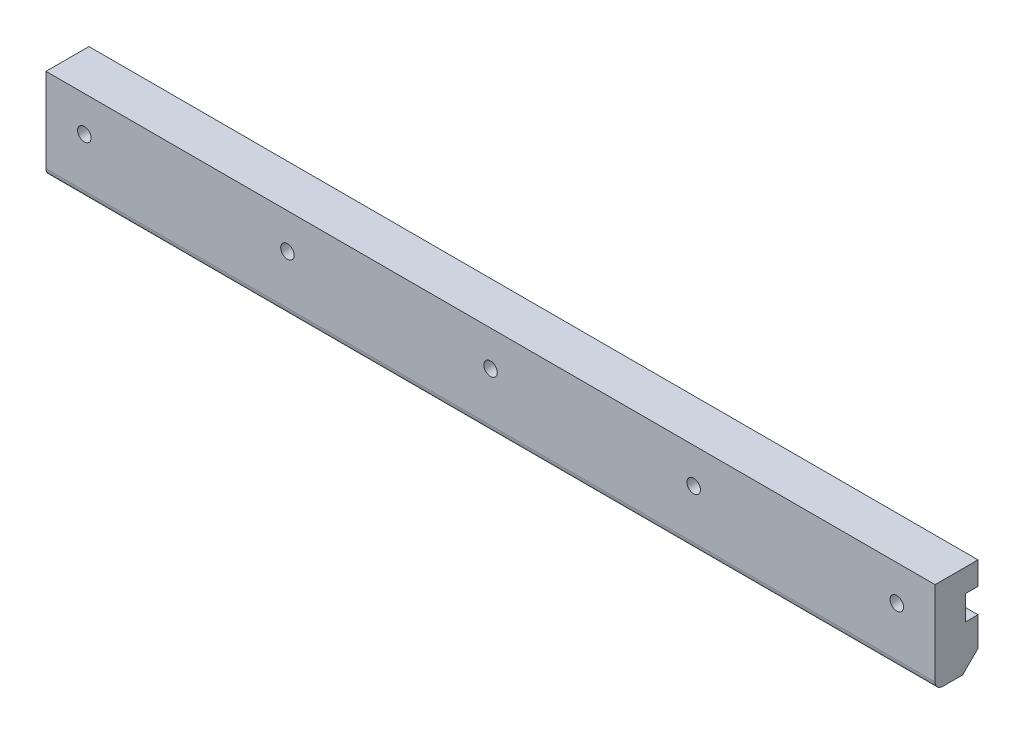
ISO-10303-21;
HEADER;
FILE_DESCRIPTION(('STEP AP214'),'2;1');
FILE_NAME('part.step','',(''),(''),'','','');
FILE_SCHEMA(('AUTOMOTIVE_DESIGN { 1 0 10303 214 1 1 1 1 }'));
ENDSEC;
DATA;
#1=APPLICATION_CONTEXT('core data for automotive mechanical design processes');
#2=APPLICATION_PROTOCOL_DEFINITION('international standard','automotive_design',2000,#1);
#3=PRODUCT_CONTEXT('',#1,'mechanical');
#4=PRODUCT('Part','Part','',(#3));
#5=PRODUCT_RELATED_PRODUCT_CATEGORY('part','',(#4));
#6=PRODUCT_DEFINITION_FORMATION('','',#4);
#7=PRODUCT_DEFINITION_CONTEXT('part definition',#1,'design');
#8=PRODUCT_DEFINITION('design','',#6,#7);
#9=PRODUCT_DEFINITION_SHAPE('','',#8);
#10=(LENGTH_UNIT() NAMED_UNIT(*) SI_UNIT(.MILLI.,.METRE.));
#11=(NAMED_UNIT(*) PLANE_ANGLE_UNIT() SI_UNIT($,.RADIAN.));
#12=(NAMED_UNIT(*) SI_UNIT($,.STERADIAN.) SOLID_ANGLE_UNIT());
#13=UNCERTAINTY_MEASURE_WITH_UNIT(LENGTH_MEASURE(1.E-05),#10,'distance_accuracy_value','');
#14=(GEOMETRIC_REPRESENTATION_CONTEXT(3) GLOBAL_UNCERTAINTY_ASSIGNED_CONTEXT((#13)) GLOBAL_UNIT_ASSIGNED_CONTEXT((#10,
#11,#12)) REPRESENTATION_CONTEXT('',''));
#15=CARTESIAN_POINT('',(0.,0.,0.));
#16=DIRECTION('',(0.,0.,1.));
#17=DIRECTION('',(1.,0.,0.));
#18=AXIS2_PLACEMENT_3D('',#15,#16,#17);
#19=CARTESIAN_POINT('',(580.,0.,-20.));
#20=DIRECTION('',(0.,0.,1.));
#21=DIRECTION('',(0.,-1.,0.));
#22=AXIS2_PLACEMENT_3D('',#19,#20,#21);
#23=PLANE('',#22);
#24=CARTESIAN_POINT('',(555.,37.,-20.));
#25=DIRECTION('',(0.,0.,-1.));
#26=DIRECTION('',(0.,1.,0.));
#27=AXIS2_PLACEMENT_3D('',#24,#25,#26);
#28=CIRCLE('',#27,4.39999999999996);
#29=CARTESIAN_POINT('',(555.,41.3999999999999,-20.));
#30=VERTEX_POINT('',#29);
#31=EDGE_CURVE('E172',#30,#30,#28,.T.);
#32=ORIENTED_EDGE('',*,*,#31,.F.);
#33=EDGE_LOOP('',(#32));
#34=FACE_BOUND('',#33,.T.);
#35=CARTESIAN_POINT('',(422.5,37.,-20.));
#36=DIRECTION('',(0.,0.,-1.));
#37=DIRECTION('',(0.,1.,0.));
#38=AXIS2_PLACEMENT_3D('',#35,#36,#37);
#39=CIRCLE('',#38,4.40000000000001);
#40=CARTESIAN_POINT('',(422.5,41.4,-20.));
#41=VERTEX_POINT('',#40);
#42=EDGE_CURVE('E168',#41,#41,#39,.T.);
#43=ORIENTED_EDGE('',*,*,#42,.F.);
#44=EDGE_LOOP('',(#43));
#45=FACE_BOUND('',#44,.T.);
#46=CARTESIAN_POINT('',(290.,37.,-20.));
#47=DIRECTION('',(0.,0.,-1.));
#48=DIRECTION('',(0.,1.,0.));
#49=AXIS2_PLACEMENT_3D('',#46,#47,#48);
#50=CIRCLE('',#49,4.40000000000001);
#51=CARTESIAN_POINT('',(290.,41.4,-20.));
#52=VERTEX_POINT('',#51);
#53=EDGE_CURVE('E164',#52,#52,#50,.T.);
#54=ORIENTED_EDGE('',*,*,#53,.F.);
#55=EDGE_LOOP('',(#54));
#56=FACE_BOUND('',#55,.T.);
#57=CARTESIAN_POINT('',(24.9999999999999,37.,-20.));
#58=DIRECTION('',(0.,0.,-1.));
#59=DIRECTION('',(0.,1.,0.));
#60=AXIS2_PLACEMENT_3D('',#57,#58,#59);
#61=CIRCLE('',#60,4.39999999999999);
#62=CARTESIAN_POINT('',(24.9999999999999,41.4,-20.));
#63=VERTEX_POINT('',#62);
#64=EDGE_CURVE('E228',#63,#63,#61,.T.);
#65=ORIENTED_EDGE('',*,*,#64,.F.);
#66=EDGE_LOOP('',(#65));
#67=FACE_BOUND('',#66,.T.);
#68=DIRECTION('',(0.,1.,0.));
#69=VECTOR('',#68,1.);
#70=CARTESIAN_POINT('',(0.,0.,-20.));
#71=LINE('',#70,#69);
#72=CARTESIAN_POINT('',(0.,29.,-20.));
#73=VERTEX_POINT('',#72);
#74=CARTESIAN_POINT('',(0.,45.,-20.));
#75=VERTEX_POINT('',#74);
#76=EDGE_CURVE('E138',#73,#75,#71,.T.);
#77=ORIENTED_EDGE('',*,*,#76,.T.);
#78=DIRECTION('',(-1.,0.,0.));
#79=VECTOR('',#78,1.);
#80=CARTESIAN_POINT('',(580.,45.,-20.));
#81=LINE('',#80,#79);
#82=CARTESIAN_POINT('',(580.,45.,-20.));
#83=VERTEX_POINT('',#82);
#84=EDGE_CURVE('E198',#83,#75,#81,.T.);
#85=ORIENTED_EDGE('',*,*,#84,.F.);
#86=DIRECTION('',(0.,1.,0.));
#87=VECTOR('',#86,1.);
#88=CARTESIAN_POINT('',(580.,0.,-20.));
#89=LINE('',#88,#87);
#90=CARTESIAN_POINT('',(580.,29.,-20.));
#91=VERTEX_POINT('',#90);
#92=EDGE_CURVE('E134',#91,#83,#89,.T.);
#93=ORIENTED_EDGE('',*,*,#92,.F.);
#94=DIRECTION('',(-1.,0.,0.));
#95=VECTOR('',#94,1.);
#96=CARTESIAN_POINT('',(580.,29.,-20.));
#97=LINE('',#96,#95);
#98=EDGE_CURVE('E200',#91,#73,#97,.T.);
#99=ORIENTED_EDGE('',*,*,#98,.T.);
#100=EDGE_LOOP('',(#77,#85,#93,#99));
#101=FACE_BOUND('',#100,.T.);
#102=CARTESIAN_POINT('',(157.5,37.,-20.));
#103=DIRECTION('',(0.,0.,-1.));
#104=DIRECTION('',(0.,1.,0.));
#105=AXIS2_PLACEMENT_3D('',#102,#103,#104);
#106=CIRCLE('',#105,4.39999999999999);
#107=CARTESIAN_POINT('',(157.5,41.4,-20.));
#108=VERTEX_POINT('',#107);
#109=EDGE_CURVE('E163',#108,#108,#106,.T.);
#110=ORIENTED_EDGE('',*,*,#109,.F.);
#111=EDGE_LOOP('',(#110));
#112=FACE_BOUND('',#111,.T.);
#113=ADVANCED_FACE('F41',(#34,#45,#56,#67,#101,#112),#23,.F.);
#114=CARTESIAN_POINT('',(580.,45.,0.));
#115=DIRECTION('',(0.,1.,0.));
#116=DIRECTION('',(0.,0.,1.));
#117=AXIS2_PLACEMENT_3D('',#114,#115,#116);
#118=PLANE('',#117);
#119=DIRECTION('',(0.,0.,-1.));
#120=VECTOR('',#119,1.);
#121=CARTESIAN_POINT('',(0.,45.,0.));
#122=LINE('',#121,#120);
#123=CARTESIAN_POINT('',(0.,45.,-28.));
#124=VERTEX_POINT('',#123);
#125=EDGE_CURVE('E142',#75,#124,#122,.T.);
#126=ORIENTED_EDGE('',*,*,#125,.T.);
#127=DIRECTION('',(-1.,0.,0.));
#128=VECTOR('',#127,1.);
#129=CARTESIAN_POINT('',(580.,45.,-28.));
#130=LINE('',#129,#128);
#131=CARTESIAN_POINT('',(580.,45.,-28.));
#132=VERTEX_POINT('',#131);
#133=EDGE_CURVE('E121',#132,#124,#130,.T.);
#134=ORIENTED_EDGE('',*,*,#133,.F.);
#135=DIRECTION('',(0.,0.,-1.));
#136=VECTOR('',#135,1.);
#137=CARTESIAN_POINT('',(580.,45.,0.));
#138=LINE('',#137,#136);
#139=EDGE_CURVE('E128',#83,#132,#138,.T.);
#140=ORIENTED_EDGE('',*,*,#139,.F.);
#141=ORIENTED_EDGE('',*,*,#84,.T.);
#142=EDGE_LOOP('',(#126,#134,#140,#141));
#143=FACE_BOUND('',#142,.T.);
#144=ADVANCED_FACE('F140',(#143),#118,.F.);
#145=CARTESIAN_POINT('',(580.,0.,-28.));
#146=DIRECTION('',(0.,0.,1.));
#147=DIRECTION('',(1.,0.,0.));
#148=AXIS2_PLACEMENT_3D('',#145,#146,#147);
#149=PLANE('',#148);
#150=DIRECTION('',(0.,1.,0.));
#151=VECTOR('',#150,1.);
#152=CARTESIAN_POINT('',(0.,0.,-28.));
#153=LINE('',#152,#151);
#154=CARTESIAN_POINT('',(0.,60.,-28.));
#155=VERTEX_POINT('',#154);
#156=EDGE_CURVE('E212',#124,#155,#153,.T.);
#157=ORIENTED_EDGE('',*,*,#156,.T.);
#158=DIRECTION('',(-1.,0.,0.));
#159=VECTOR('',#158,1.);
#160=CARTESIAN_POINT('',(580.,60.,-28.));
#161=LINE('',#160,#159);
#162=CARTESIAN_POINT('',(580.,60.,-28.));
#163=VERTEX_POINT('',#162);
#164=EDGE_CURVE('E123',#163,#155,#161,.T.);
#165=ORIENTED_EDGE('',*,*,#164,.F.);
#166=DIRECTION('',(0.,1.,0.));
#167=VECTOR('',#166,1.);
#168=CARTESIAN_POINT('',(580.,0.,-28.));
#169=LINE('',#168,#167);
#170=EDGE_CURVE('E116',#132,#163,#169,.T.);
#171=ORIENTED_EDGE('',*,*,#170,.F.);
#172=ORIENTED_EDGE('',*,*,#133,.T.);
#173=EDGE_LOOP('',(#157,#165,#171,#172));
#174=FACE_BOUND('',#173,.T.);
#175=ADVANCED_FACE('F119',(#174),#149,.F.);
#176=CARTESIAN_POINT('',(580.,60.,0.));
#177=DIRECTION('',(0.,1.,0.));
#178=DIRECTION('',(0.,0.,1.));
#179=AXIS2_PLACEMENT_3D('',#176,#177,#178);
#180=PLANE('',#179);
#181=DIRECTION('',(0.,0.,-1.));
#182=VECTOR('',#181,1.);
#183=CARTESIAN_POINT('',(0.,60.,0.));
#184=LINE('',#183,#182);
#185=CARTESIAN_POINT('',(0.,60.,0.));
#186=VERTEX_POINT('',#185);
#187=EDGE_CURVE('E191',#186,#155,#184,.T.);
#188=ORIENTED_EDGE('',*,*,#187,.F.);
#189=DIRECTION('',(-1.,0.,0.));
#190=VECTOR('',#189,1.);
#191=CARTESIAN_POINT('',(580.,60.,0.));
#192=LINE('',#191,#190);
#193=CARTESIAN_POINT('',(580.,60.,0.));
#194=VERTEX_POINT('',#193);
#195=EDGE_CURVE('E148',#194,#186,#192,.T.);
#196=ORIENTED_EDGE('',*,*,#195,.F.);
#197=DIRECTION('',(0.,0.,-1.));
#198=VECTOR('',#197,1.);
#199=CARTESIAN_POINT('',(580.,60.,0.));
#200=LINE('',#199,#198);
#201=EDGE_CURVE('E127',#194,#163,#200,.T.);
#202=ORIENTED_EDGE('',*,*,#201,.T.);
#203=ORIENTED_EDGE('',*,*,#164,.T.);
#204=EDGE_LOOP('',(#188,#196,#202,#203));
#205=FACE_BOUND('',#204,.T.);
#206=ADVANCED_FACE('F211',(#205),#180,.T.);
#207=CARTESIAN_POINT('',(580.,0.,0.));
#208=DIRECTION('',(0.,0.,1.));
#209=DIRECTION('',(1.,0.,0.));
#210=AXIS2_PLACEMENT_3D('',#207,#208,#209);
#211=PLANE('',#210);
#212=CARTESIAN_POINT('',(555.,37.,0.));
#213=DIRECTION('',(0.,0.,1.));
#214=DIRECTION('',(1.,0.,0.));
#215=AXIS2_PLACEMENT_3D('',#212,#213,#214);
#216=CIRCLE('',#215,4.39999999999996);
#217=CARTESIAN_POINT('',(559.4,37.,0.));
#218=VERTEX_POINT('',#217);
#219=EDGE_CURVE('E169',#218,#218,#216,.T.);
#220=ORIENTED_EDGE('',*,*,#219,.F.);
#221=EDGE_LOOP('',(#220));
#222=FACE_BOUND('',#221,.T.);
#223=CARTESIAN_POINT('',(422.5,37.,0.));
#224=DIRECTION('',(0.,0.,1.));
#225=DIRECTION('',(1.,0.,0.));
#226=AXIS2_PLACEMENT_3D('',#223,#224,#225);
#227=CIRCLE('',#226,4.39999999999999);
#228=CARTESIAN_POINT('',(426.9,37.,0.));
#229=VERTEX_POINT('',#228);
#230=EDGE_CURVE('E165',#229,#229,#227,.T.);
#231=ORIENTED_EDGE('',*,*,#230,.F.);
#232=EDGE_LOOP('',(#231));
#233=FACE_BOUND('',#232,.T.);
#234=CARTESIAN_POINT('',(290.,37.,0.));
#235=DIRECTION('',(0.,0.,1.));
#236=DIRECTION('',(1.,0.,0.));
#237=AXIS2_PLACEMENT_3D('',#234,#235,#236);
#238=CIRCLE('',#237,4.39999999999999);
#239=CARTESIAN_POINT('',(294.4,37.,0.));
#240=VERTEX_POINT('',#239);
#241=EDGE_CURVE('E160',#240,#240,#238,.T.);
#242=ORIENTED_EDGE('',*,*,#241,.F.);
#243=EDGE_LOOP('',(#242));
#244=FACE_BOUND('',#243,.T.);
#245=CARTESIAN_POINT('',(157.5,37.,0.));
#246=DIRECTION('',(0.,0.,1.));
#247=DIRECTION('',(1.,0.,0.));
#248=AXIS2_PLACEMENT_3D('',#245,#246,#247);
#249=CIRCLE('',#248,4.39999999999999);
#250=CARTESIAN_POINT('',(161.9,37.,0.));
#251=VERTEX_POINT('',#250);
#252=EDGE_CURVE('E231',#251,#251,#249,.T.);
#253=ORIENTED_EDGE('',*,*,#252,.F.);
#254=EDGE_LOOP('',(#253));
#255=FACE_BOUND('',#254,.T.);
#256=CARTESIAN_POINT('',(24.9999999999999,37.,0.));
#257=DIRECTION('',(0.,0.,1.));
#258=DIRECTION('',(1.,0.,0.));
#259=AXIS2_PLACEMENT_3D('',#256,#257,#258);
#260=CIRCLE('',#259,4.39999999999998);
#261=CARTESIAN_POINT('',(29.3999999999999,37.,0.));
#262=VERTEX_POINT('',#261);
#263=EDGE_CURVE('E216',#262,#262,#260,.T.);
#264=ORIENTED_EDGE('',*,*,#263,.F.);
#265=EDGE_LOOP('',(#264));
#266=FACE_BOUND('',#265,.T.);
#267=DIRECTION('',(0.,1.,0.));
#268=VECTOR('',#267,1.);
#269=CARTESIAN_POINT('',(0.,0.,0.));
#270=LINE('',#269,#268);
#271=CARTESIAN_POINT('',(0.,5.,0.));
#272=VERTEX_POINT('',#271);
#273=EDGE_CURVE('E187',#272,#186,#270,.T.);
#274=ORIENTED_EDGE('',*,*,#273,.F.);
#275=DIRECTION('',(-1.,0.,0.));
#276=VECTOR('',#275,1.);
#277=CARTESIAN_POINT('',(580.,5.,0.));
#278=LINE('',#277,#276);
#279=CARTESIAN_POINT('',(580.,5.,0.));
#280=VERTEX_POINT('',#279);
#281=EDGE_CURVE('E49',#272,#280,#278,.F.);
#282=ORIENTED_EDGE('',*,*,#281,.T.);
#283=DIRECTION('',(0.,1.,0.));
#284=VECTOR('',#283,1.);
#285=CARTESIAN_POINT('',(580.,0.,0.));
#286=LINE('',#285,#284);
#287=EDGE_CURVE('E208',#280,#194,#286,.T.);
#288=ORIENTED_EDGE('',*,*,#287,.T.);
#289=ORIENTED_EDGE('',*,*,#195,.T.);
#290=EDGE_LOOP('',(#274,#282,#288,#289));
#291=FACE_BOUND('',#290,.T.);
#292=ADVANCED_FACE('F207',(#222,#233,#244,#255,#266,#291),#211,.T.);
#293=CARTESIAN_POINT('',(580.,0.,0.));
#294=DIRECTION('',(0.,1.,0.));
#295=DIRECTION('',(0.,0.,1.));
#296=AXIS2_PLACEMENT_3D('',#293,#294,#295);
#297=PLANE('',#296);
#298=DIRECTION('',(0.,0.,-1.));
#299=VECTOR('',#298,1.);
#300=CARTESIAN_POINT('',(580.,0.,0.));
#301=LINE('',#300,#299);
#302=CARTESIAN_POINT('',(580.,0.,-5.));
#303=VERTEX_POINT('',#302);
#304=CARTESIAN_POINT('',(580.,0.,-17.9999999999999));
#305=VERTEX_POINT('',#304);
#306=EDGE_CURVE('E180',#303,#305,#301,.T.);
#307=ORIENTED_EDGE('',*,*,#306,.F.);
#308=DIRECTION('',(-1.,0.,0.));
#309=VECTOR('',#308,1.);
#310=CARTESIAN_POINT('',(0.,0.,-5.));
#311=LINE('',#310,#309);
#312=CARTESIAN_POINT('',(0.,0.,-5.));
#313=VERTEX_POINT('',#312);
#314=EDGE_CURVE('E159',#303,#313,#311,.T.);
#315=ORIENTED_EDGE('',*,*,#314,.T.);
#316=DIRECTION('',(0.,0.,-1.));
#317=VECTOR('',#316,1.);
#318=CARTESIAN_POINT('',(0.,0.,0.));
#319=LINE('',#318,#317);
#320=CARTESIAN_POINT('',(0.,0.,-17.9999999999999));
#321=VERTEX_POINT('',#320);
#322=EDGE_CURVE('E179',#313,#321,#319,.T.);
#323=ORIENTED_EDGE('',*,*,#322,.T.);
#324=DIRECTION('',(1.,0.,0.));
#325=VECTOR('',#324,1.);
#326=CARTESIAN_POINT('',(580.,0.,-17.9999999999999));
#327=LINE('',#326,#325);
#328=EDGE_CURVE('E154',#321,#305,#327,.T.);
#329=ORIENTED_EDGE('',*,*,#328,.T.);
#330=EDGE_LOOP('',(#307,#315,#323,#329));
#331=FACE_BOUND('',#330,.T.);
#332=ADVANCED_FACE('F178',(#331),#297,.F.);
#333=CARTESIAN_POINT('',(580.,0.,-28.));
#334=DIRECTION('',(0.,0.,1.));
#335=DIRECTION('',(1.,0.,0.));
#336=AXIS2_PLACEMENT_3D('',#333,#334,#335);
#337=PLANE('',#336);
#338=DIRECTION('',(0.,1.,0.));
#339=VECTOR('',#338,1.);
#340=CARTESIAN_POINT('',(580.,0.,-28.));
#341=LINE('',#340,#339);
#342=CARTESIAN_POINT('',(580.,10.0000000000001,-28.));
#343=VERTEX_POINT('',#342);
#344=CARTESIAN_POINT('',(580.,29.,-28.));
#345=VERTEX_POINT('',#344);
#346=EDGE_CURVE('E221',#343,#345,#341,.T.);
#347=ORIENTED_EDGE('',*,*,#346,.F.);
#348=DIRECTION('',(-1.,0.,0.));
#349=VECTOR('',#348,1.);
#350=CARTESIAN_POINT('',(580.,10.0000000000001,-28.));
#351=LINE('',#350,#349);
#352=CARTESIAN_POINT('',(0.,10.0000000000001,-28.));
#353=VERTEX_POINT('',#352);
#354=EDGE_CURVE('E143',#343,#353,#351,.T.);
#355=ORIENTED_EDGE('',*,*,#354,.T.);
#356=DIRECTION('',(0.,1.,0.));
#357=VECTOR('',#356,1.);
#358=CARTESIAN_POINT('',(0.,0.,-28.));
#359=LINE('',#358,#357);
#360=CARTESIAN_POINT('',(0.,29.,-28.));
#361=VERTEX_POINT('',#360);
#362=EDGE_CURVE('E186',#353,#361,#359,.T.);
#363=ORIENTED_EDGE('',*,*,#362,.T.);
#364=DIRECTION('',(-1.,0.,0.));
#365=VECTOR('',#364,1.);
#366=CARTESIAN_POINT('',(580.,29.,-28.));
#367=LINE('',#366,#365);
#368=EDGE_CURVE('E202',#345,#361,#367,.T.);
#369=ORIENTED_EDGE('',*,*,#368,.F.);
#370=EDGE_LOOP('',(#347,#355,#363,#369));
#371=FACE_BOUND('',#370,.T.);
#372=ADVANCED_FACE('F283',(#371),#337,.F.);
#373=CARTESIAN_POINT('',(580.,29.,0.));
#374=DIRECTION('',(0.,1.,0.));
#375=DIRECTION('',(0.,0.,1.));
#376=AXIS2_PLACEMENT_3D('',#373,#374,#375);
#377=PLANE('',#376);
#378=DIRECTION('',(0.,0.,-1.));
#379=VECTOR('',#378,1.);
#380=CARTESIAN_POINT('',(0.,29.,0.));
#381=LINE('',#380,#379);
#382=EDGE_CURVE('E189',#73,#361,#381,.T.);
#383=ORIENTED_EDGE('',*,*,#382,.F.);
#384=ORIENTED_EDGE('',*,*,#98,.F.);
#385=DIRECTION('',(0.,0.,-1.));
#386=VECTOR('',#385,1.);
#387=CARTESIAN_POINT('',(580.,29.,0.));
#388=LINE('',#387,#386);
#389=EDGE_CURVE('E218',#91,#345,#388,.T.);
#390=ORIENTED_EDGE('',*,*,#389,.T.);
#391=ORIENTED_EDGE('',*,*,#368,.T.);
#392=EDGE_LOOP('',(#383,#384,#390,#391));
#393=FACE_BOUND('',#392,.T.);
#394=ADVANCED_FACE('F278',(#393),#377,.T.);
#395=CARTESIAN_POINT('',(580.,0.,0.));
#396=DIRECTION('',(1.,0.,0.));
#397=DIRECTION('',(0.,0.,-1.));
#398=AXIS2_PLACEMENT_3D('',#395,#396,#397);
#399=PLANE('',#398);
#400=ORIENTED_EDGE('',*,*,#287,.F.);
#401=CARTESIAN_POINT('',(580.,5.,-5.));
#402=DIRECTION('',(1.,0.,0.));
#403=DIRECTION('',(0.,0.,-1.));
#404=AXIS2_PLACEMENT_3D('',#401,#402,#403);
#405=CIRCLE('',#404,5.);
#406=EDGE_CURVE('E11',#280,#303,#405,.T.);
#407=ORIENTED_EDGE('',*,*,#406,.T.);
#408=ORIENTED_EDGE('',*,*,#306,.T.);
#409=DIRECTION('',(0.,-0.707106781186548,0.707106781186548));
#410=VECTOR('',#409,1.);
#411=CARTESIAN_POINT('',(580.,-8.99999999999997,-8.99999999999997));
#412=LINE('',#411,#410);
#413=EDGE_CURVE('E157',#305,#343,#412,.F.);
#414=ORIENTED_EDGE('',*,*,#413,.T.);
#415=ORIENTED_EDGE('',*,*,#346,.T.);
#416=ORIENTED_EDGE('',*,*,#389,.F.);
#417=ORIENTED_EDGE('',*,*,#92,.T.);
#418=ORIENTED_EDGE('',*,*,#139,.T.);
#419=ORIENTED_EDGE('',*,*,#170,.T.);
#420=ORIENTED_EDGE('',*,*,#201,.F.);
#421=EDGE_LOOP('',(#400,#407,#408,#414,#415,#416,#417,#418,#419,#420));
#422=FACE_BOUND('',#421,.T.);
#423=ADVANCED_FACE('F131',(#422),#399,.T.);
#424=CARTESIAN_POINT('',(0.,0.,0.));
#425=DIRECTION('',(1.,0.,0.));
#426=DIRECTION('',(0.,0.,-1.));
#427=AXIS2_PLACEMENT_3D('',#424,#425,#426);
#428=PLANE('',#427);
#429=ORIENTED_EDGE('',*,*,#322,.F.);
#430=CARTESIAN_POINT('',(0.,5.,-5.));
#431=DIRECTION('',(1.,0.,0.));
#432=DIRECTION('',(0.,0.,-1.));
#433=AXIS2_PLACEMENT_3D('',#430,#431,#432);
#434=CIRCLE('',#433,5.);
#435=EDGE_CURVE('E63',#313,#272,#434,.F.);
#436=ORIENTED_EDGE('',*,*,#435,.T.);
#437=ORIENTED_EDGE('',*,*,#273,.T.);
#438=ORIENTED_EDGE('',*,*,#187,.T.);
#439=ORIENTED_EDGE('',*,*,#156,.F.);
#440=ORIENTED_EDGE('',*,*,#125,.F.);
#441=ORIENTED_EDGE('',*,*,#76,.F.);
#442=ORIENTED_EDGE('',*,*,#382,.T.);
#443=ORIENTED_EDGE('',*,*,#362,.F.);
#444=DIRECTION('',(0.,0.707106781186548,-0.707106781186548));
#445=VECTOR('',#444,1.);
#446=CARTESIAN_POINT('',(0.,10.0000000000001,-28.));
#447=LINE('',#446,#445);
#448=EDGE_CURVE('E146',#353,#321,#447,.F.);
#449=ORIENTED_EDGE('',*,*,#448,.T.);
#450=EDGE_LOOP('',(#429,#436,#437,#438,#439,#440,#441,#442,#443,#449));
#451=FACE_BOUND('',#450,.T.);
#452=ADVANCED_FACE('F183',(#451),#428,.F.);
#453=CARTESIAN_POINT('',(580.,10.0000000000001,-28.));
#454=DIRECTION('',(0.,0.707106781186547,0.707106781186547));
#455=DIRECTION('',(-1.,0.,0.));
#456=AXIS2_PLACEMENT_3D('',#453,#454,#455);
#457=PLANE('',#456);
#458=ORIENTED_EDGE('',*,*,#413,.F.);
#459=ORIENTED_EDGE('',*,*,#328,.F.);
#460=ORIENTED_EDGE('',*,*,#448,.F.);
#461=ORIENTED_EDGE('',*,*,#354,.F.);
#462=EDGE_LOOP('',(#458,#459,#460,#461));
#463=FACE_BOUND('',#462,.T.);
#464=ADVANCED_FACE('F271',(#463),#457,.F.);
#465=CARTESIAN_POINT('',(24.9999999999999,37.,-20.));
#466=DIRECTION('',(0.,0.,-1.));
#467=DIRECTION('',(0.,1.,0.));
#468=AXIS2_PLACEMENT_3D('',#465,#466,#467);
#469=CYLINDRICAL_SURFACE('',#468,4.39999999999998);
#470=ORIENTED_EDGE('',*,*,#263,.T.);
#471=EDGE_LOOP('',(#470));
#472=FACE_BOUND('',#471,.T.);
#473=ORIENTED_EDGE('',*,*,#64,.T.);
#474=EDGE_LOOP('',(#473));
#475=FACE_BOUND('',#474,.T.);
#476=ADVANCED_FACE('F261',(#472,#475),#469,.F.);
#477=CARTESIAN_POINT('',(157.5,37.,-20.));
#478=DIRECTION('',(0.,0.,-1.));
#479=DIRECTION('',(0.,1.,0.));
#480=AXIS2_PLACEMENT_3D('',#477,#478,#479);
#481=CYLINDRICAL_SURFACE('',#480,4.39999999999999);
#482=ORIENTED_EDGE('',*,*,#252,.T.);
#483=EDGE_LOOP('',(#482));
#484=FACE_BOUND('',#483,.T.);
#485=ORIENTED_EDGE('',*,*,#109,.T.);
#486=EDGE_LOOP('',(#485));
#487=FACE_BOUND('',#486,.T.);
#488=ADVANCED_FACE('F258',(#484,#487),#481,.F.);
#489=CARTESIAN_POINT('',(290.,37.,-20.));
#490=DIRECTION('',(0.,0.,-1.));
#491=DIRECTION('',(0.,1.,0.));
#492=AXIS2_PLACEMENT_3D('',#489,#490,#491);
#493=CYLINDRICAL_SURFACE('',#492,4.39999999999999);
#494=ORIENTED_EDGE('',*,*,#241,.T.);
#495=EDGE_LOOP('',(#494));
#496=FACE_BOUND('',#495,.T.);
#497=ORIENTED_EDGE('',*,*,#53,.T.);
#498=EDGE_LOOP('',(#497));
#499=FACE_BOUND('',#498,.T.);
#500=ADVANCED_FACE('F260',(#496,#499),#493,.F.);
#501=CARTESIAN_POINT('',(422.5,37.,-20.));
#502=DIRECTION('',(0.,0.,-1.));
#503=DIRECTION('',(0.,1.,0.));
#504=AXIS2_PLACEMENT_3D('',#501,#502,#503);
#505=CYLINDRICAL_SURFACE('',#504,4.39999999999999);
#506=ORIENTED_EDGE('',*,*,#230,.T.);
#507=EDGE_LOOP('',(#506));
#508=FACE_BOUND('',#507,.T.);
#509=ORIENTED_EDGE('',*,*,#42,.T.);
#510=EDGE_LOOP('',(#509));
#511=FACE_BOUND('',#510,.T.);
#512=ADVANCED_FACE('F268',(#508,#511),#505,.F.);
#513=CARTESIAN_POINT('',(555.,37.,-20.));
#514=DIRECTION('',(0.,0.,-1.));
#515=DIRECTION('',(0.,1.,0.));
#516=AXIS2_PLACEMENT_3D('',#513,#514,#515);
#517=CYLINDRICAL_SURFACE('',#516,4.39999999999996);
#518=ORIENTED_EDGE('',*,*,#219,.T.);
#519=EDGE_LOOP('',(#518));
#520=FACE_BOUND('',#519,.T.);
#521=ORIENTED_EDGE('',*,*,#31,.T.);
#522=EDGE_LOOP('',(#521));
#523=FACE_BOUND('',#522,.T.);
#524=ADVANCED_FACE('F243',(#520,#523),#517,.F.);
#525=CARTESIAN_POINT('',(580.,5.,-5.));
#526=DIRECTION('',(1.,0.,0.));
#527=DIRECTION('',(0.,0.,-1.));
#528=AXIS2_PLACEMENT_3D('',#525,#526,#527);
#529=CYLINDRICAL_SURFACE('',#528,5.);
#530=ORIENTED_EDGE('',*,*,#406,.F.);
#531=ORIENTED_EDGE('',*,*,#281,.F.);
#532=ORIENTED_EDGE('',*,*,#435,.F.);
#533=ORIENTED_EDGE('',*,*,#314,.F.);
#534=EDGE_LOOP('',(#530,#531,#532,#533));
#535=FACE_BOUND('',#534,.T.);
#536=ADVANCED_FACE('F43',(#535),#529,.T.);
#537=CLOSED_SHELL('',(#113,#144,#175,#206,#292,#332,#372,#394,#423,#452,#464,#476,#488,#500,
#512,#524,#536));
#538=MANIFOLD_SOLID_BREP('B2',#537);
#539=ADVANCED_BREP_SHAPE_REPRESENTATION('',(#18,#538),#14);
#540=SHAPE_DEFINITION_REPRESENTATION(#9,#539);
ENDSEC;
END-ISO-10303-21;
